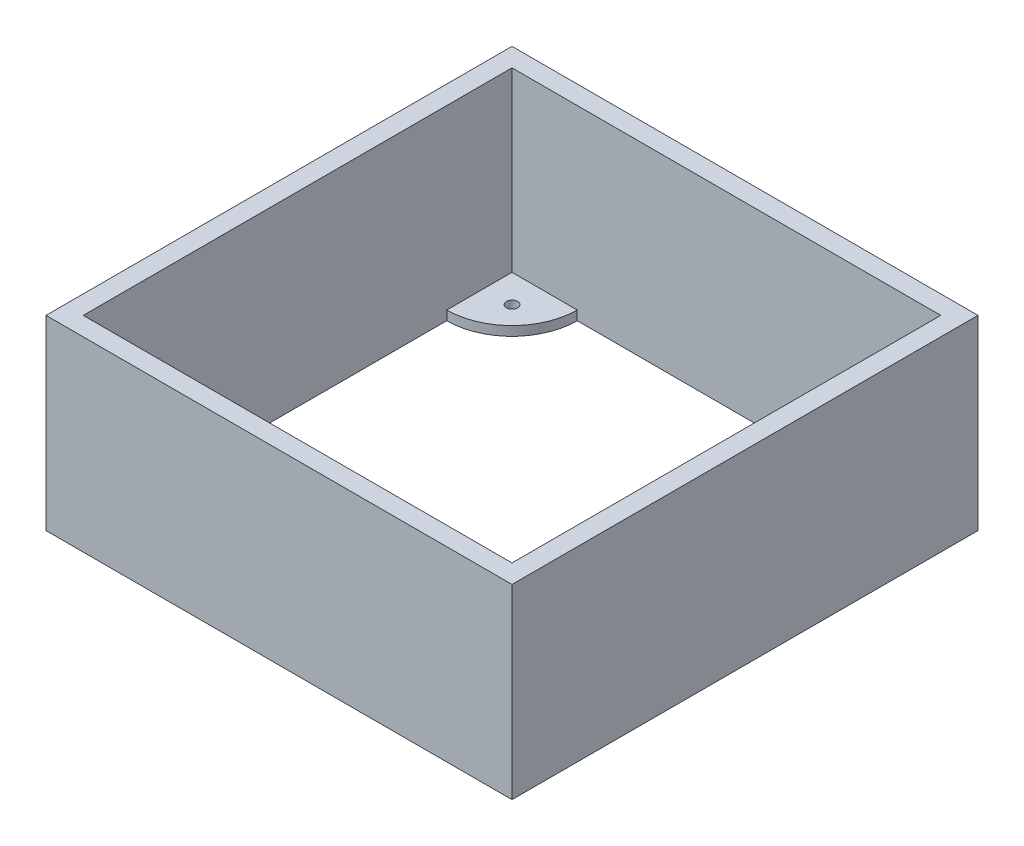
ISO-10303-21;
HEADER;
FILE_DESCRIPTION(('STEP AP214'),'2;1');
FILE_NAME('part.step','',(''),(''),'','','');
FILE_SCHEMA(('AUTOMOTIVE_DESIGN { 1 0 10303 214 1 1 1 1 }'));
ENDSEC;
DATA;
#1=APPLICATION_CONTEXT('core data for automotive mechanical design processes');
#2=APPLICATION_PROTOCOL_DEFINITION('international standard','automotive_design',2000,#1);
#3=PRODUCT_CONTEXT('',#1,'mechanical');
#4=PRODUCT('Part','Part','',(#3));
#5=PRODUCT_RELATED_PRODUCT_CATEGORY('part','',(#4));
#6=PRODUCT_DEFINITION_FORMATION('','',#4);
#7=PRODUCT_DEFINITION_CONTEXT('part definition',#1,'design');
#8=PRODUCT_DEFINITION('design','',#6,#7);
#9=PRODUCT_DEFINITION_SHAPE('','',#8);
#10=(LENGTH_UNIT() NAMED_UNIT(*) SI_UNIT(.MILLI.,.METRE.));
#11=(NAMED_UNIT(*) PLANE_ANGLE_UNIT() SI_UNIT($,.RADIAN.));
#12=(NAMED_UNIT(*) SI_UNIT($,.STERADIAN.) SOLID_ANGLE_UNIT());
#13=UNCERTAINTY_MEASURE_WITH_UNIT(LENGTH_MEASURE(1.E-05),#10,'distance_accuracy_value','');
#14=(GEOMETRIC_REPRESENTATION_CONTEXT(3) GLOBAL_UNCERTAINTY_ASSIGNED_CONTEXT((#13)) GLOBAL_UNIT_ASSIGNED_CONTEXT((#10,
#11,#12)) REPRESENTATION_CONTEXT('',''));
#15=CARTESIAN_POINT('',(0.,0.,0.));
#16=DIRECTION('',(0.,0.,1.));
#17=DIRECTION('',(1.,0.,0.));
#18=AXIS2_PLACEMENT_3D('',#15,#16,#17);
#19=CARTESIAN_POINT('',(0.,40.,0.));
#20=DIRECTION('',(0.,-1.,0.));
#21=DIRECTION('',(0.,0.,-1.));
#22=AXIS2_PLACEMENT_3D('',#19,#20,#21);
#23=PLANE('',#22);
#24=DIRECTION('',(0.,0.,-1.));
#25=VECTOR('',#24,1.);
#26=CARTESIAN_POINT('',(50.,40.,50.));
#27=LINE('',#26,#25);
#28=CARTESIAN_POINT('',(50.,40.,50.));
#29=VERTEX_POINT('',#28);
#30=CARTESIAN_POINT('',(50.,40.,-50.));
#31=VERTEX_POINT('',#30);
#32=EDGE_CURVE('E186',#29,#31,#27,.T.);
#33=ORIENTED_EDGE('',*,*,#32,.T.);
#34=DIRECTION('',(-1.,0.,0.));
#35=VECTOR('',#34,1.);
#36=CARTESIAN_POINT('',(-50.,40.,-50.));
#37=LINE('',#36,#35);
#38=CARTESIAN_POINT('',(-50.,40.,-50.));
#39=VERTEX_POINT('',#38);
#40=EDGE_CURVE('E189',#31,#39,#37,.T.);
#41=ORIENTED_EDGE('',*,*,#40,.T.);
#42=DIRECTION('',(0.,0.,1.));
#43=VECTOR('',#42,1.);
#44=CARTESIAN_POINT('',(-50.,40.,50.));
#45=LINE('',#44,#43);
#46=CARTESIAN_POINT('',(-50.,40.,50.));
#47=VERTEX_POINT('',#46);
#48=EDGE_CURVE('E192',#39,#47,#45,.T.);
#49=ORIENTED_EDGE('',*,*,#48,.T.);
#50=DIRECTION('',(1.,0.,0.));
#51=VECTOR('',#50,1.);
#52=CARTESIAN_POINT('',(-50.,40.,50.));
#53=LINE('',#52,#51);
#54=EDGE_CURVE('E194',#47,#29,#53,.T.);
#55=ORIENTED_EDGE('',*,*,#54,.T.);
#56=EDGE_LOOP('',(#33,#41,#49,#55));
#57=FACE_BOUND('',#56,.T.);
#58=DIRECTION('',(0.,0.,-1.));
#59=VECTOR('',#58,1.);
#60=CARTESIAN_POINT('',(46.,40.,-46.));
#61=LINE('',#60,#59);
#62=CARTESIAN_POINT('',(46.,40.,46.));
#63=VERTEX_POINT('',#62);
#64=CARTESIAN_POINT('',(46.,40.,-46.));
#65=VERTEX_POINT('',#64);
#66=EDGE_CURVE('E394',#63,#65,#61,.T.);
#67=ORIENTED_EDGE('',*,*,#66,.F.);
#68=DIRECTION('',(1.,0.,0.));
#69=VECTOR('',#68,1.);
#70=CARTESIAN_POINT('',(-46.,40.,46.));
#71=LINE('',#70,#69);
#72=CARTESIAN_POINT('',(-46.,40.,46.));
#73=VERTEX_POINT('',#72);
#74=EDGE_CURVE('E168',#73,#63,#71,.T.);
#75=ORIENTED_EDGE('',*,*,#74,.F.);
#76=DIRECTION('',(0.,0.,1.));
#77=VECTOR('',#76,1.);
#78=CARTESIAN_POINT('',(-46.,40.,-46.));
#79=LINE('',#78,#77);
#80=CARTESIAN_POINT('',(-46.,40.,-46.));
#81=VERTEX_POINT('',#80);
#82=EDGE_CURVE('E174',#81,#73,#79,.T.);
#83=ORIENTED_EDGE('',*,*,#82,.F.);
#84=DIRECTION('',(-1.,0.,0.));
#85=VECTOR('',#84,1.);
#86=CARTESIAN_POINT('',(-46.,40.,-46.));
#87=LINE('',#86,#85);
#88=EDGE_CURVE('E396',#65,#81,#87,.T.);
#89=ORIENTED_EDGE('',*,*,#88,.F.);
#90=EDGE_LOOP('',(#67,#75,#83,#89));
#91=FACE_BOUND('',#90,.T.);
#92=ADVANCED_FACE('F33',(#57,#91),#23,.F.);
#93=CARTESIAN_POINT('',(0.,0.,0.));
#94=DIRECTION('',(0.,-1.,0.));
#95=DIRECTION('',(0.,0.,-1.));
#96=AXIS2_PLACEMENT_3D('',#93,#94,#95);
#97=PLANE('',#96);
#98=CARTESIAN_POINT('',(39.9999999999934,0.,40.));
#99=DIRECTION('',(0.,-1.,0.));
#100=DIRECTION('',(0.,0.,-1.));
#101=AXIS2_PLACEMENT_3D('',#98,#99,#100);
#102=CIRCLE('',#101,1.19999999999999);
#103=CARTESIAN_POINT('',(39.9999999999934,0.,38.8));
#104=VERTEX_POINT('',#103);
#105=EDGE_CURVE('E316',#104,#104,#102,.T.);
#106=ORIENTED_EDGE('',*,*,#105,.F.);
#107=EDGE_LOOP('',(#106));
#108=FACE_BOUND('',#107,.T.);
#109=CARTESIAN_POINT('',(39.9999999999934,0.,-40.));
#110=DIRECTION('',(0.,-1.,0.));
#111=DIRECTION('',(0.,0.,-1.));
#112=AXIS2_PLACEMENT_3D('',#109,#110,#111);
#113=CIRCLE('',#112,1.19999999999999);
#114=CARTESIAN_POINT('',(39.9999999999934,0.,-41.2));
#115=VERTEX_POINT('',#114);
#116=EDGE_CURVE('E320',#115,#115,#113,.T.);
#117=ORIENTED_EDGE('',*,*,#116,.F.);
#118=EDGE_LOOP('',(#117));
#119=FACE_BOUND('',#118,.T.);
#120=CARTESIAN_POINT('',(-40.,0.,-40.));
#121=DIRECTION('',(0.,-1.,0.));
#122=DIRECTION('',(0.,0.,-1.));
#123=AXIS2_PLACEMENT_3D('',#120,#121,#122);
#124=CIRCLE('',#123,1.19999999999999);
#125=CARTESIAN_POINT('',(-40.,0.,-41.2));
#126=VERTEX_POINT('',#125);
#127=EDGE_CURVE('E329',#126,#126,#124,.T.);
#128=ORIENTED_EDGE('',*,*,#127,.F.);
#129=EDGE_LOOP('',(#128));
#130=FACE_BOUND('',#129,.T.);
#131=CARTESIAN_POINT('',(-40.,0.,40.));
#132=DIRECTION('',(0.,-1.,0.));
#133=DIRECTION('',(0.,0.,-1.));
#134=AXIS2_PLACEMENT_3D('',#131,#132,#133);
#135=CIRCLE('',#134,1.19999999999999);
#136=CARTESIAN_POINT('',(-40.,0.,38.8));
#137=VERTEX_POINT('',#136);
#138=EDGE_CURVE('E335',#137,#137,#135,.T.);
#139=ORIENTED_EDGE('',*,*,#138,.F.);
#140=EDGE_LOOP('',(#139));
#141=FACE_BOUND('',#140,.T.);
#142=CARTESIAN_POINT('',(45.9999999999934,0.,45.9999999999988));
#143=DIRECTION('',(0.,-1.,0.));
#144=DIRECTION('',(0.,0.,-1.));
#145=AXIS2_PLACEMENT_3D('',#142,#143,#144);
#146=CIRCLE('',#145,14.);
#147=CARTESIAN_POINT('',(31.9999999999934,0.,45.9999999999988));
#148=VERTEX_POINT('',#147);
#149=CARTESIAN_POINT('',(45.9999999999934,0.,31.9999999999988));
#150=VERTEX_POINT('',#149);
#151=EDGE_CURVE('E164',#148,#150,#146,.T.);
#152=ORIENTED_EDGE('',*,*,#151,.T.);
#153=DIRECTION('',(0.,0.,-1.));
#154=VECTOR('',#153,1.);
#155=CARTESIAN_POINT('',(46.,0.,-46.));
#156=LINE('',#155,#154);
#157=CARTESIAN_POINT('',(46.,0.,-32.));
#158=VERTEX_POINT('',#157);
#159=EDGE_CURVE('E391',#150,#158,#156,.T.);
#160=ORIENTED_EDGE('',*,*,#159,.T.);
#161=CARTESIAN_POINT('',(46.,0.,-46.));
#162=DIRECTION('',(0.,-1.,0.));
#163=DIRECTION('',(0.,0.,-1.));
#164=AXIS2_PLACEMENT_3D('',#161,#162,#163);
#165=CIRCLE('',#164,14.);
#166=CARTESIAN_POINT('',(32.,0.,-46.));
#167=VERTEX_POINT('',#166);
#168=EDGE_CURVE('E375',#158,#167,#165,.T.);
#169=ORIENTED_EDGE('',*,*,#168,.T.);
#170=DIRECTION('',(-1.,0.,0.));
#171=VECTOR('',#170,1.);
#172=CARTESIAN_POINT('',(-46.,0.,-46.));
#173=LINE('',#172,#171);
#174=CARTESIAN_POINT('',(-31.9999999999988,0.,-46.0000000000066));
#175=VERTEX_POINT('',#174);
#176=EDGE_CURVE('E401',#167,#175,#173,.T.);
#177=ORIENTED_EDGE('',*,*,#176,.T.);
#178=CARTESIAN_POINT('',(-45.9999999999988,0.,-46.0000000000066));
#179=DIRECTION('',(0.,-1.,0.));
#180=DIRECTION('',(0.,0.,-1.));
#181=AXIS2_PLACEMENT_3D('',#178,#179,#180);
#182=CIRCLE('',#181,14.);
#183=CARTESIAN_POINT('',(-46.,0.,-32.0000000000066));
#184=VERTEX_POINT('',#183);
#185=EDGE_CURVE('E54',#175,#184,#182,.T.);
#186=ORIENTED_EDGE('',*,*,#185,.T.);
#187=DIRECTION('',(0.,0.,1.));
#188=VECTOR('',#187,1.);
#189=CARTESIAN_POINT('',(-46.,0.,-46.));
#190=LINE('',#189,#188);
#191=CARTESIAN_POINT('',(-46.0000000000054,0.,31.9999999999922));
#192=VERTEX_POINT('',#191);
#193=EDGE_CURVE('E402',#184,#192,#190,.T.);
#194=ORIENTED_EDGE('',*,*,#193,.T.);
#195=CARTESIAN_POINT('',(-46.0000000000054,0.,45.9999999999922));
#196=DIRECTION('',(0.,-1.,0.));
#197=DIRECTION('',(0.,0.,-1.));
#198=AXIS2_PLACEMENT_3D('',#195,#196,#197);
#199=CIRCLE('',#198,14.);
#200=CARTESIAN_POINT('',(-32.0000000000055,0.,46.));
#201=VERTEX_POINT('',#200);
#202=EDGE_CURVE('E48',#192,#201,#199,.T.);
#203=ORIENTED_EDGE('',*,*,#202,.T.);
#204=DIRECTION('',(1.,0.,0.));
#205=VECTOR('',#204,1.);
#206=CARTESIAN_POINT('',(-46.,0.,46.));
#207=LINE('',#206,#205);
#208=EDGE_CURVE('E177',#201,#148,#207,.T.);
#209=ORIENTED_EDGE('',*,*,#208,.T.);
#210=EDGE_LOOP('',(#152,#160,#169,#177,#186,#194,#203,#209));
#211=FACE_BOUND('',#210,.T.);
#212=DIRECTION('',(0.,0.,-1.));
#213=VECTOR('',#212,1.);
#214=CARTESIAN_POINT('',(50.,0.,50.));
#215=LINE('',#214,#213);
#216=CARTESIAN_POINT('',(50.,0.,50.));
#217=VERTEX_POINT('',#216);
#218=CARTESIAN_POINT('',(50.,0.,-50.));
#219=VERTEX_POINT('',#218);
#220=EDGE_CURVE('E185',#217,#219,#215,.T.);
#221=ORIENTED_EDGE('',*,*,#220,.F.);
#222=DIRECTION('',(1.,0.,0.));
#223=VECTOR('',#222,1.);
#224=CARTESIAN_POINT('',(-50.,0.,50.));
#225=LINE('',#224,#223);
#226=CARTESIAN_POINT('',(-50.,0.,50.));
#227=VERTEX_POINT('',#226);
#228=EDGE_CURVE('E190',#227,#217,#225,.T.);
#229=ORIENTED_EDGE('',*,*,#228,.F.);
#230=DIRECTION('',(0.,0.,1.));
#231=VECTOR('',#230,1.);
#232=CARTESIAN_POINT('',(-50.,0.,50.));
#233=LINE('',#232,#231);
#234=CARTESIAN_POINT('',(-50.,0.,-50.));
#235=VERTEX_POINT('',#234);
#236=EDGE_CURVE('E201',#235,#227,#233,.T.);
#237=ORIENTED_EDGE('',*,*,#236,.F.);
#238=DIRECTION('',(-1.,0.,0.));
#239=VECTOR('',#238,1.);
#240=CARTESIAN_POINT('',(-50.,0.,-50.));
#241=LINE('',#240,#239);
#242=EDGE_CURVE('E199',#219,#235,#241,.T.);
#243=ORIENTED_EDGE('',*,*,#242,.F.);
#244=EDGE_LOOP('',(#221,#229,#237,#243));
#245=FACE_BOUND('',#244,.T.);
#246=ADVANCED_FACE('F219',(#108,#119,#130,#141,#211,#245),#97,.T.);
#247=CARTESIAN_POINT('',(50.,40.,50.));
#248=DIRECTION('',(-1.,0.,0.));
#249=DIRECTION('',(0.,0.,1.));
#250=AXIS2_PLACEMENT_3D('',#247,#248,#249);
#251=PLANE('',#250);
#252=ORIENTED_EDGE('',*,*,#220,.T.);
#253=DIRECTION('',(0.,-1.,0.));
#254=VECTOR('',#253,1.);
#255=CARTESIAN_POINT('',(50.,40.,-50.));
#256=LINE('',#255,#254);
#257=EDGE_CURVE('E11',#31,#219,#256,.T.);
#258=ORIENTED_EDGE('',*,*,#257,.F.);
#259=ORIENTED_EDGE('',*,*,#32,.F.);
#260=DIRECTION('',(0.,-1.,0.));
#261=VECTOR('',#260,1.);
#262=CARTESIAN_POINT('',(50.,40.,50.));
#263=LINE('',#262,#261);
#264=EDGE_CURVE('E196',#29,#217,#263,.T.);
#265=ORIENTED_EDGE('',*,*,#264,.T.);
#266=EDGE_LOOP('',(#252,#258,#259,#265));
#267=FACE_BOUND('',#266,.T.);
#268=ADVANCED_FACE('F35',(#267),#251,.F.);
#269=CARTESIAN_POINT('',(-50.,40.,-50.));
#270=DIRECTION('',(0.,0.,1.));
#271=DIRECTION('',(1.,0.,0.));
#272=AXIS2_PLACEMENT_3D('',#269,#270,#271);
#273=PLANE('',#272);
#274=ORIENTED_EDGE('',*,*,#242,.T.);
#275=DIRECTION('',(0.,-1.,0.));
#276=VECTOR('',#275,1.);
#277=CARTESIAN_POINT('',(-50.,40.,-50.));
#278=LINE('',#277,#276);
#279=EDGE_CURVE('E41',#39,#235,#278,.T.);
#280=ORIENTED_EDGE('',*,*,#279,.F.);
#281=ORIENTED_EDGE('',*,*,#40,.F.);
#282=ORIENTED_EDGE('',*,*,#257,.T.);
#283=EDGE_LOOP('',(#274,#280,#281,#282));
#284=FACE_BOUND('',#283,.T.);
#285=ADVANCED_FACE('F229',(#284),#273,.F.);
#286=CARTESIAN_POINT('',(-50.,40.,50.));
#287=DIRECTION('',(1.,0.,0.));
#288=DIRECTION('',(0.,0.,-1.));
#289=AXIS2_PLACEMENT_3D('',#286,#287,#288);
#290=PLANE('',#289);
#291=ORIENTED_EDGE('',*,*,#236,.T.);
#292=DIRECTION('',(0.,-1.,0.));
#293=VECTOR('',#292,1.);
#294=CARTESIAN_POINT('',(-50.,40.,50.));
#295=LINE('',#294,#293);
#296=EDGE_CURVE('E206',#47,#227,#295,.T.);
#297=ORIENTED_EDGE('',*,*,#296,.F.);
#298=ORIENTED_EDGE('',*,*,#48,.F.);
#299=ORIENTED_EDGE('',*,*,#279,.T.);
#300=EDGE_LOOP('',(#291,#297,#298,#299));
#301=FACE_BOUND('',#300,.T.);
#302=ADVANCED_FACE('F213',(#301),#290,.F.);
#303=CARTESIAN_POINT('',(-50.,40.,50.));
#304=DIRECTION('',(0.,0.,-1.));
#305=DIRECTION('',(-1.,0.,0.));
#306=AXIS2_PLACEMENT_3D('',#303,#304,#305);
#307=PLANE('',#306);
#308=ORIENTED_EDGE('',*,*,#228,.T.);
#309=ORIENTED_EDGE('',*,*,#264,.F.);
#310=ORIENTED_EDGE('',*,*,#54,.F.);
#311=ORIENTED_EDGE('',*,*,#296,.T.);
#312=EDGE_LOOP('',(#308,#309,#310,#311));
#313=FACE_BOUND('',#312,.T.);
#314=ADVANCED_FACE('F222',(#313),#307,.F.);
#315=CARTESIAN_POINT('',(46.,40.,-46.));
#316=DIRECTION('',(-1.,0.,0.));
#317=DIRECTION('',(0.,0.,1.));
#318=AXIS2_PLACEMENT_3D('',#315,#316,#317);
#319=PLANE('',#318);
#320=DIRECTION('',(0.,-1.,0.));
#321=VECTOR('',#320,1.);
#322=CARTESIAN_POINT('',(45.9999999999934,2.,31.9999999999988));
#323=LINE('',#322,#321);
#324=CARTESIAN_POINT('',(45.9999999999934,2.,31.9999999999988));
#325=VERTEX_POINT('',#324);
#326=EDGE_CURVE('E163',#325,#150,#323,.T.);
#327=ORIENTED_EDGE('',*,*,#326,.F.);
#328=DIRECTION('',(0.,0.,1.));
#329=VECTOR('',#328,1.);
#330=CARTESIAN_POINT('',(45.9999999999934,2.,45.9999999999988));
#331=LINE('',#330,#329);
#332=CARTESIAN_POINT('',(45.9999999999934,2.,45.9999999999988));
#333=VERTEX_POINT('',#332);
#334=EDGE_CURVE('E149',#325,#333,#331,.T.);
#335=ORIENTED_EDGE('',*,*,#334,.T.);
#336=DIRECTION('',(0.,-1.,0.));
#337=VECTOR('',#336,1.);
#338=CARTESIAN_POINT('',(46.,40.,46.));
#339=LINE('',#338,#337);
#340=EDGE_CURVE('E160',#63,#333,#339,.T.);
#341=ORIENTED_EDGE('',*,*,#340,.F.);
#342=ORIENTED_EDGE('',*,*,#66,.T.);
#343=DIRECTION('',(0.,-1.,0.));
#344=VECTOR('',#343,1.);
#345=CARTESIAN_POINT('',(46.,40.,-46.));
#346=LINE('',#345,#344);
#347=CARTESIAN_POINT('',(46.,2.,-46.));
#348=VERTEX_POINT('',#347);
#349=EDGE_CURVE('E182',#65,#348,#346,.T.);
#350=ORIENTED_EDGE('',*,*,#349,.T.);
#351=DIRECTION('',(0.,0.,1.));
#352=VECTOR('',#351,1.);
#353=CARTESIAN_POINT('',(46.,2.,-32.));
#354=LINE('',#353,#352);
#355=CARTESIAN_POINT('',(46.,2.,-32.));
#356=VERTEX_POINT('',#355);
#357=EDGE_CURVE('E380',#348,#356,#354,.T.);
#358=ORIENTED_EDGE('',*,*,#357,.T.);
#359=DIRECTION('',(0.,-1.,0.));
#360=VECTOR('',#359,1.);
#361=CARTESIAN_POINT('',(46.,2.,-32.));
#362=LINE('',#361,#360);
#363=EDGE_CURVE('E386',#356,#158,#362,.T.);
#364=ORIENTED_EDGE('',*,*,#363,.T.);
#365=ORIENTED_EDGE('',*,*,#159,.F.);
#366=EDGE_LOOP('',(#327,#335,#341,#342,#350,#358,#364,#365));
#367=FACE_BOUND('',#366,.T.);
#368=ADVANCED_FACE('F159',(#367),#319,.T.);
#369=CARTESIAN_POINT('',(-46.,40.,-46.));
#370=DIRECTION('',(0.,0.,1.));
#371=DIRECTION('',(1.,0.,0.));
#372=AXIS2_PLACEMENT_3D('',#369,#370,#371);
#373=PLANE('',#372);
#374=DIRECTION('',(0.,-1.,0.));
#375=VECTOR('',#374,1.);
#376=CARTESIAN_POINT('',(-31.9999999999988,2.,-46.0000000000066));
#377=LINE('',#376,#375);
#378=CARTESIAN_POINT('',(-31.9999999999988,2.,-46.0000000000066));
#379=VERTEX_POINT('',#378);
#380=EDGE_CURVE('E371',#379,#175,#377,.T.);
#381=ORIENTED_EDGE('',*,*,#380,.T.);
#382=ORIENTED_EDGE('',*,*,#176,.F.);
#383=DIRECTION('',(0.,-1.,0.));
#384=VECTOR('',#383,1.);
#385=CARTESIAN_POINT('',(32.,2.,-46.));
#386=LINE('',#385,#384);
#387=CARTESIAN_POINT('',(32.,2.,-46.));
#388=VERTEX_POINT('',#387);
#389=EDGE_CURVE('E388',#388,#167,#386,.T.);
#390=ORIENTED_EDGE('',*,*,#389,.F.);
#391=DIRECTION('',(1.,0.,0.));
#392=VECTOR('',#391,1.);
#393=CARTESIAN_POINT('',(46.,2.,-46.));
#394=LINE('',#393,#392);
#395=EDGE_CURVE('E377',#388,#348,#394,.T.);
#396=ORIENTED_EDGE('',*,*,#395,.T.);
#397=ORIENTED_EDGE('',*,*,#349,.F.);
#398=ORIENTED_EDGE('',*,*,#88,.T.);
#399=DIRECTION('',(0.,-1.,0.));
#400=VECTOR('',#399,1.);
#401=CARTESIAN_POINT('',(-46.,40.,-46.));
#402=LINE('',#401,#400);
#403=CARTESIAN_POINT('',(-45.9999999999988,2.,-46.0000000000066));
#404=VERTEX_POINT('',#403);
#405=EDGE_CURVE('E172',#81,#404,#402,.T.);
#406=ORIENTED_EDGE('',*,*,#405,.T.);
#407=DIRECTION('',(1.,0.,0.));
#408=VECTOR('',#407,1.);
#409=CARTESIAN_POINT('',(-31.9999999999988,2.,-46.0000000000066));
#410=LINE('',#409,#408);
#411=EDGE_CURVE('E365',#404,#379,#410,.T.);
#412=ORIENTED_EDGE('',*,*,#411,.T.);
#413=EDGE_LOOP('',(#381,#382,#390,#396,#397,#398,#406,#412));
#414=FACE_BOUND('',#413,.T.);
#415=ADVANCED_FACE('F250',(#414),#373,.T.);
#416=CARTESIAN_POINT('',(-46.,40.,-46.));
#417=DIRECTION('',(1.,0.,0.));
#418=DIRECTION('',(0.,0.,-1.));
#419=AXIS2_PLACEMENT_3D('',#416,#417,#418);
#420=PLANE('',#419);
#421=DIRECTION('',(0.,-1.,0.));
#422=VECTOR('',#421,1.);
#423=CARTESIAN_POINT('',(-46.0000000000054,2.,31.9999999999922));
#424=LINE('',#423,#422);
#425=CARTESIAN_POINT('',(-46.0000000000054,2.,31.9999999999922));
#426=VERTEX_POINT('',#425);
#427=EDGE_CURVE('E356',#426,#192,#424,.T.);
#428=ORIENTED_EDGE('',*,*,#427,.T.);
#429=ORIENTED_EDGE('',*,*,#193,.F.);
#430=DIRECTION('',(0.,-1.,0.));
#431=VECTOR('',#430,1.);
#432=CARTESIAN_POINT('',(-45.9999999999988,2.,-32.0000000000066));
#433=LINE('',#432,#431);
#434=CARTESIAN_POINT('',(-45.9999999999988,2.,-32.0000000000066));
#435=VERTEX_POINT('',#434);
#436=EDGE_CURVE('E373',#435,#184,#433,.T.);
#437=ORIENTED_EDGE('',*,*,#436,.F.);
#438=DIRECTION('',(0.,0.,-1.));
#439=VECTOR('',#438,1.);
#440=CARTESIAN_POINT('',(-45.9999999999988,2.,-46.0000000000066));
#441=LINE('',#440,#439);
#442=EDGE_CURVE('E362',#435,#404,#441,.T.);
#443=ORIENTED_EDGE('',*,*,#442,.T.);
#444=ORIENTED_EDGE('',*,*,#405,.F.);
#445=ORIENTED_EDGE('',*,*,#82,.T.);
#446=DIRECTION('',(0.,-1.,0.));
#447=VECTOR('',#446,1.);
#448=CARTESIAN_POINT('',(-46.,40.,46.));
#449=LINE('',#448,#447);
#450=CARTESIAN_POINT('',(-46.0000000000054,2.,45.9999999999922));
#451=VERTEX_POINT('',#450);
#452=EDGE_CURVE('E169',#73,#451,#449,.T.);
#453=ORIENTED_EDGE('',*,*,#452,.T.);
#454=DIRECTION('',(0.,0.,-1.));
#455=VECTOR('',#454,1.);
#456=CARTESIAN_POINT('',(-46.0000000000054,2.,31.9999999999922));
#457=LINE('',#456,#455);
#458=EDGE_CURVE('E350',#451,#426,#457,.T.);
#459=ORIENTED_EDGE('',*,*,#458,.T.);
#460=EDGE_LOOP('',(#428,#429,#437,#443,#444,#445,#453,#459));
#461=FACE_BOUND('',#460,.T.);
#462=ADVANCED_FACE('F254',(#461),#420,.T.);
#463=CARTESIAN_POINT('',(-46.,40.,46.));
#464=DIRECTION('',(0.,0.,-1.));
#465=DIRECTION('',(-1.,0.,0.));
#466=AXIS2_PLACEMENT_3D('',#463,#464,#465);
#467=PLANE('',#466);
#468=DIRECTION('',(0.,-1.,0.));
#469=VECTOR('',#468,1.);
#470=CARTESIAN_POINT('',(31.9999999999934,2.,45.9999999999988));
#471=LINE('',#470,#469);
#472=CARTESIAN_POINT('',(31.9999999999934,2.,45.9999999999988));
#473=VERTEX_POINT('',#472);
#474=EDGE_CURVE('E342',#473,#148,#471,.T.);
#475=ORIENTED_EDGE('',*,*,#474,.T.);
#476=ORIENTED_EDGE('',*,*,#208,.F.);
#477=DIRECTION('',(0.,-1.,0.));
#478=VECTOR('',#477,1.);
#479=CARTESIAN_POINT('',(-32.0000000000055,2.,45.9999999999922));
#480=LINE('',#479,#478);
#481=CARTESIAN_POINT('',(-32.0000000000055,2.,45.9999999999922));
#482=VERTEX_POINT('',#481);
#483=EDGE_CURVE('E358',#482,#201,#480,.T.);
#484=ORIENTED_EDGE('',*,*,#483,.F.);
#485=DIRECTION('',(-1.,0.,0.));
#486=VECTOR('',#485,1.);
#487=CARTESIAN_POINT('',(-46.0000000000054,2.,45.9999999999922));
#488=LINE('',#487,#486);
#489=EDGE_CURVE('E347',#482,#451,#488,.T.);
#490=ORIENTED_EDGE('',*,*,#489,.T.);
#491=ORIENTED_EDGE('',*,*,#452,.F.);
#492=ORIENTED_EDGE('',*,*,#74,.T.);
#493=ORIENTED_EDGE('',*,*,#340,.T.);
#494=DIRECTION('',(-1.,0.,0.));
#495=VECTOR('',#494,1.);
#496=CARTESIAN_POINT('',(31.9999999999934,2.,45.9999999999988));
#497=LINE('',#496,#495);
#498=EDGE_CURVE('E146',#333,#473,#497,.T.);
#499=ORIENTED_EDGE('',*,*,#498,.T.);
#500=EDGE_LOOP('',(#475,#476,#484,#490,#491,#492,#493,#499));
#501=FACE_BOUND('',#500,.T.);
#502=ADVANCED_FACE('F166',(#501),#467,.T.);
#503=CARTESIAN_POINT('',(46.,2.,-46.));
#504=DIRECTION('',(0.,-1.,0.));
#505=DIRECTION('',(0.,0.,-1.));
#506=AXIS2_PLACEMENT_3D('',#503,#504,#505);
#507=CYLINDRICAL_SURFACE('',#506,14.);
#508=ORIENTED_EDGE('',*,*,#168,.F.);
#509=ORIENTED_EDGE('',*,*,#363,.F.);
#510=CARTESIAN_POINT('',(46.,2.,-46.));
#511=DIRECTION('',(0.,-1.,0.));
#512=DIRECTION('',(0.,0.,-1.));
#513=AXIS2_PLACEMENT_3D('',#510,#511,#512);
#514=CIRCLE('',#513,14.);
#515=EDGE_CURVE('E383',#356,#388,#514,.T.);
#516=ORIENTED_EDGE('',*,*,#515,.T.);
#517=ORIENTED_EDGE('',*,*,#389,.T.);
#518=EDGE_LOOP('',(#508,#509,#516,#517));
#519=FACE_BOUND('',#518,.T.);
#520=ADVANCED_FACE('F265',(#519),#507,.T.);
#521=CARTESIAN_POINT('',(46.,2.,-46.));
#522=DIRECTION('',(0.,-1.,0.));
#523=DIRECTION('',(0.,0.,-1.));
#524=AXIS2_PLACEMENT_3D('',#521,#522,#523);
#525=PLANE('',#524);
#526=CARTESIAN_POINT('',(39.9999999999934,2.,-40.));
#527=DIRECTION('',(0.,-1.,0.));
#528=DIRECTION('',(0.,0.,-1.));
#529=AXIS2_PLACEMENT_3D('',#526,#527,#528);
#530=CIRCLE('',#529,1.19999999999999);
#531=CARTESIAN_POINT('',(39.9999999999934,2.,-41.2));
#532=VERTEX_POINT('',#531);
#533=EDGE_CURVE('E323',#532,#532,#530,.T.);
#534=ORIENTED_EDGE('',*,*,#533,.T.);
#535=EDGE_LOOP('',(#534));
#536=FACE_BOUND('',#535,.T.);
#537=ORIENTED_EDGE('',*,*,#395,.F.);
#538=ORIENTED_EDGE('',*,*,#515,.F.);
#539=ORIENTED_EDGE('',*,*,#357,.F.);
#540=EDGE_LOOP('',(#537,#538,#539));
#541=FACE_BOUND('',#540,.T.);
#542=ADVANCED_FACE('F268',(#536,#541),#525,.F.);
#543=CARTESIAN_POINT('',(-45.9999999999988,2.,-46.0000000000066));
#544=DIRECTION('',(0.,-1.,0.));
#545=DIRECTION('',(0.,0.,-1.));
#546=AXIS2_PLACEMENT_3D('',#543,#544,#545);
#547=CYLINDRICAL_SURFACE('',#546,14.);
#548=ORIENTED_EDGE('',*,*,#185,.F.);
#549=ORIENTED_EDGE('',*,*,#380,.F.);
#550=CARTESIAN_POINT('',(-45.9999999999988,2.,-46.0000000000066));
#551=DIRECTION('',(0.,-1.,0.));
#552=DIRECTION('',(0.,0.,-1.));
#553=AXIS2_PLACEMENT_3D('',#550,#551,#552);
#554=CIRCLE('',#553,14.);
#555=EDGE_CURVE('E368',#379,#435,#554,.T.);
#556=ORIENTED_EDGE('',*,*,#555,.T.);
#557=ORIENTED_EDGE('',*,*,#436,.T.);
#558=EDGE_LOOP('',(#548,#549,#556,#557));
#559=FACE_BOUND('',#558,.T.);
#560=ADVANCED_FACE('F272',(#559),#547,.T.);
#561=CARTESIAN_POINT('',(-45.9999999999988,2.,-46.0000000000066));
#562=DIRECTION('',(0.,-1.,0.));
#563=DIRECTION('',(0.,0.,-1.));
#564=AXIS2_PLACEMENT_3D('',#561,#562,#563);
#565=PLANE('',#564);
#566=CARTESIAN_POINT('',(-40.,2.,-40.));
#567=DIRECTION('',(0.,-1.,0.));
#568=DIRECTION('',(0.,0.,-1.));
#569=AXIS2_PLACEMENT_3D('',#566,#567,#568);
#570=CIRCLE('',#569,1.19999999999999);
#571=CARTESIAN_POINT('',(-40.,2.,-41.2));
#572=VERTEX_POINT('',#571);
#573=EDGE_CURVE('E332',#572,#572,#570,.T.);
#574=ORIENTED_EDGE('',*,*,#573,.T.);
#575=EDGE_LOOP('',(#574));
#576=FACE_BOUND('',#575,.T.);
#577=ORIENTED_EDGE('',*,*,#442,.F.);
#578=ORIENTED_EDGE('',*,*,#555,.F.);
#579=ORIENTED_EDGE('',*,*,#411,.F.);
#580=EDGE_LOOP('',(#577,#578,#579));
#581=FACE_BOUND('',#580,.T.);
#582=ADVANCED_FACE('F276',(#576,#581),#565,.F.);
#583=CARTESIAN_POINT('',(-46.0000000000054,2.,45.9999999999922));
#584=DIRECTION('',(0.,-1.,0.));
#585=DIRECTION('',(0.,0.,-1.));
#586=AXIS2_PLACEMENT_3D('',#583,#584,#585);
#587=CYLINDRICAL_SURFACE('',#586,14.);
#588=ORIENTED_EDGE('',*,*,#202,.F.);
#589=ORIENTED_EDGE('',*,*,#427,.F.);
#590=CARTESIAN_POINT('',(-46.0000000000054,2.,45.9999999999922));
#591=DIRECTION('',(0.,-1.,0.));
#592=DIRECTION('',(0.,0.,-1.));
#593=AXIS2_PLACEMENT_3D('',#590,#591,#592);
#594=CIRCLE('',#593,14.);
#595=EDGE_CURVE('E353',#426,#482,#594,.T.);
#596=ORIENTED_EDGE('',*,*,#595,.T.);
#597=ORIENTED_EDGE('',*,*,#483,.T.);
#598=EDGE_LOOP('',(#588,#589,#596,#597));
#599=FACE_BOUND('',#598,.T.);
#600=ADVANCED_FACE('F280',(#599),#587,.T.);
#601=CARTESIAN_POINT('',(-46.0000000000054,2.,45.9999999999922));
#602=DIRECTION('',(0.,-1.,0.));
#603=DIRECTION('',(0.,0.,-1.));
#604=AXIS2_PLACEMENT_3D('',#601,#602,#603);
#605=PLANE('',#604);
#606=CARTESIAN_POINT('',(-40.,2.,40.));
#607=DIRECTION('',(0.,-1.,0.));
#608=DIRECTION('',(0.,0.,-1.));
#609=AXIS2_PLACEMENT_3D('',#606,#607,#608);
#610=CIRCLE('',#609,1.19999999999999);
#611=CARTESIAN_POINT('',(-40.,2.,38.8));
#612=VERTEX_POINT('',#611);
#613=EDGE_CURVE('E338',#612,#612,#610,.T.);
#614=ORIENTED_EDGE('',*,*,#613,.T.);
#615=EDGE_LOOP('',(#614));
#616=FACE_BOUND('',#615,.T.);
#617=ORIENTED_EDGE('',*,*,#489,.F.);
#618=ORIENTED_EDGE('',*,*,#595,.F.);
#619=ORIENTED_EDGE('',*,*,#458,.F.);
#620=EDGE_LOOP('',(#617,#618,#619));
#621=FACE_BOUND('',#620,.T.);
#622=ADVANCED_FACE('F284',(#616,#621),#605,.F.);
#623=CARTESIAN_POINT('',(45.9999999999934,2.,45.9999999999988));
#624=DIRECTION('',(0.,-1.,0.));
#625=DIRECTION('',(0.,0.,-1.));
#626=AXIS2_PLACEMENT_3D('',#623,#624,#625);
#627=CYLINDRICAL_SURFACE('',#626,14.);
#628=ORIENTED_EDGE('',*,*,#151,.F.);
#629=ORIENTED_EDGE('',*,*,#474,.F.);
#630=CARTESIAN_POINT('',(45.9999999999934,2.,45.9999999999988));
#631=DIRECTION('',(0.,-1.,0.));
#632=DIRECTION('',(0.,0.,-1.));
#633=AXIS2_PLACEMENT_3D('',#630,#631,#632);
#634=CIRCLE('',#633,14.);
#635=EDGE_CURVE('E151',#473,#325,#634,.T.);
#636=ORIENTED_EDGE('',*,*,#635,.T.);
#637=ORIENTED_EDGE('',*,*,#326,.T.);
#638=EDGE_LOOP('',(#628,#629,#636,#637));
#639=FACE_BOUND('',#638,.T.);
#640=ADVANCED_FACE('F288',(#639),#627,.T.);
#641=CARTESIAN_POINT('',(45.9999999999934,2.,45.9999999999988));
#642=DIRECTION('',(0.,-1.,0.));
#643=DIRECTION('',(0.,0.,-1.));
#644=AXIS2_PLACEMENT_3D('',#641,#642,#643);
#645=PLANE('',#644);
#646=CARTESIAN_POINT('',(39.9999999999934,2.,40.));
#647=DIRECTION('',(0.,-1.,0.));
#648=DIRECTION('',(0.,0.,-1.));
#649=AXIS2_PLACEMENT_3D('',#646,#647,#648);
#650=CIRCLE('',#649,1.19999999999999);
#651=CARTESIAN_POINT('',(39.9999999999934,2.,38.8));
#652=VERTEX_POINT('',#651);
#653=EDGE_CURVE('E319',#652,#652,#650,.T.);
#654=ORIENTED_EDGE('',*,*,#653,.T.);
#655=EDGE_LOOP('',(#654));
#656=FACE_BOUND('',#655,.T.);
#657=ORIENTED_EDGE('',*,*,#334,.F.);
#658=ORIENTED_EDGE('',*,*,#635,.F.);
#659=ORIENTED_EDGE('',*,*,#498,.F.);
#660=EDGE_LOOP('',(#657,#658,#659));
#661=FACE_BOUND('',#660,.T.);
#662=ADVANCED_FACE('F148',(#656,#661),#645,.F.);
#663=CARTESIAN_POINT('',(-40.,0.,40.));
#664=DIRECTION('',(0.,-1.,0.));
#665=DIRECTION('',(0.,0.,-1.));
#666=AXIS2_PLACEMENT_3D('',#663,#664,#665);
#667=CYLINDRICAL_SURFACE('',#666,1.19999999999999);
#668=ORIENTED_EDGE('',*,*,#138,.T.);
#669=EDGE_LOOP('',(#668));
#670=FACE_BOUND('',#669,.T.);
#671=ORIENTED_EDGE('',*,*,#613,.F.);
#672=EDGE_LOOP('',(#671));
#673=FACE_BOUND('',#672,.T.);
#674=ADVANCED_FACE('F295',(#670,#673),#667,.F.);
#675=CARTESIAN_POINT('',(-40.,0.,-40.));
#676=DIRECTION('',(0.,-1.,0.));
#677=DIRECTION('',(0.,0.,-1.));
#678=AXIS2_PLACEMENT_3D('',#675,#676,#677);
#679=CYLINDRICAL_SURFACE('',#678,1.19999999999999);
#680=ORIENTED_EDGE('',*,*,#127,.T.);
#681=EDGE_LOOP('',(#680));
#682=FACE_BOUND('',#681,.T.);
#683=ORIENTED_EDGE('',*,*,#573,.F.);
#684=EDGE_LOOP('',(#683));
#685=FACE_BOUND('',#684,.T.);
#686=ADVANCED_FACE('F299',(#682,#685),#679,.F.);
#687=CARTESIAN_POINT('',(39.9999999999934,0.,-40.));
#688=DIRECTION('',(0.,-1.,0.));
#689=DIRECTION('',(0.,0.,-1.));
#690=AXIS2_PLACEMENT_3D('',#687,#688,#689);
#691=CYLINDRICAL_SURFACE('',#690,1.19999999999999);
#692=ORIENTED_EDGE('',*,*,#116,.T.);
#693=EDGE_LOOP('',(#692));
#694=FACE_BOUND('',#693,.T.);
#695=ORIENTED_EDGE('',*,*,#533,.F.);
#696=EDGE_LOOP('',(#695));
#697=FACE_BOUND('',#696,.T.);
#698=ADVANCED_FACE('F303',(#694,#697),#691,.F.);
#699=CARTESIAN_POINT('',(39.9999999999934,0.,40.));
#700=DIRECTION('',(0.,-1.,0.));
#701=DIRECTION('',(0.,0.,-1.));
#702=AXIS2_PLACEMENT_3D('',#699,#700,#701);
#703=CYLINDRICAL_SURFACE('',#702,1.19999999999999);
#704=ORIENTED_EDGE('',*,*,#105,.T.);
#705=EDGE_LOOP('',(#704));
#706=FACE_BOUND('',#705,.T.);
#707=ORIENTED_EDGE('',*,*,#653,.F.);
#708=EDGE_LOOP('',(#707));
#709=FACE_BOUND('',#708,.T.);
#710=ADVANCED_FACE('F307',(#706,#709),#703,.F.);
#711=CLOSED_SHELL('',(#92,#246,#268,#285,#302,#314,#368,#415,#462,#502,#520,#542,#560,#582,#600,
#622,#640,#662,#674,#686,#698,#710));
#712=MANIFOLD_SOLID_BREP('B2',#711);
#713=ADVANCED_BREP_SHAPE_REPRESENTATION('',(#18,#712),#14);
#714=SHAPE_DEFINITION_REPRESENTATION(#9,#713);
ENDSEC;
END-ISO-10303-21;
